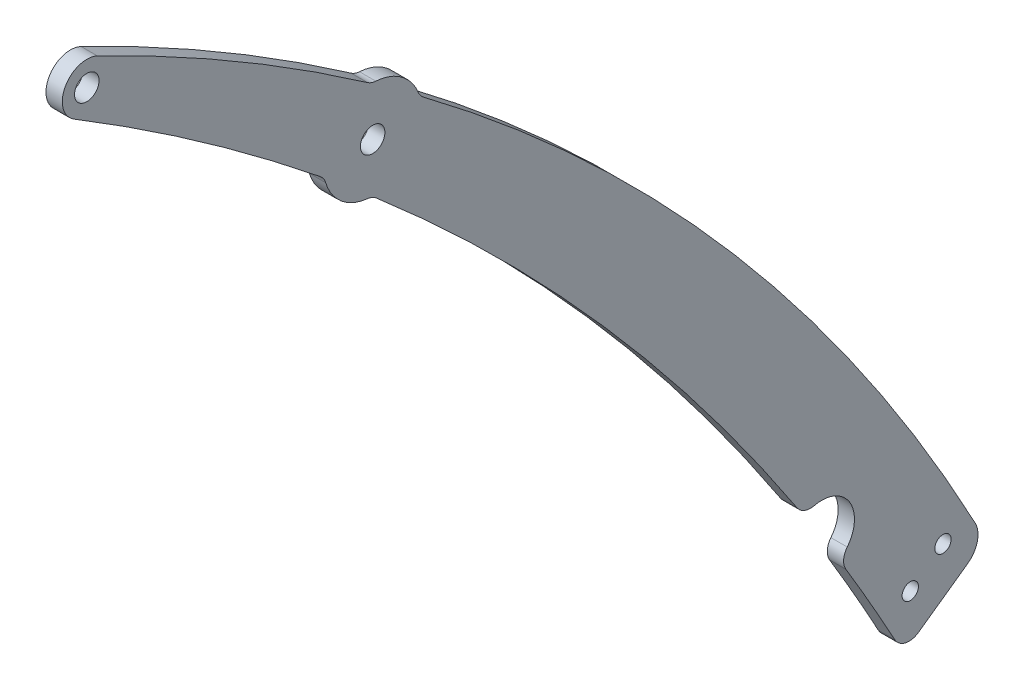
ISO-10303-21;
HEADER;
FILE_DESCRIPTION(('STEP AP214'),'2;1');
FILE_NAME('part.step','',(''),(''),'','','');
FILE_SCHEMA(('AUTOMOTIVE_DESIGN { 1 0 10303 214 1 1 1 1 }'));
ENDSEC;
DATA;
#1=APPLICATION_CONTEXT('core data for automotive mechanical design processes');
#2=APPLICATION_PROTOCOL_DEFINITION('international standard','automotive_design',2000,#1);
#3=PRODUCT_CONTEXT('',#1,'mechanical');
#4=PRODUCT('Part','Part','',(#3));
#5=PRODUCT_RELATED_PRODUCT_CATEGORY('part','',(#4));
#6=PRODUCT_DEFINITION_FORMATION('','',#4);
#7=PRODUCT_DEFINITION_CONTEXT('part definition',#1,'design');
#8=PRODUCT_DEFINITION('design','',#6,#7);
#9=PRODUCT_DEFINITION_SHAPE('','',#8);
#10=(LENGTH_UNIT() NAMED_UNIT(*) SI_UNIT(.MILLI.,.METRE.));
#11=(NAMED_UNIT(*) PLANE_ANGLE_UNIT() SI_UNIT($,.RADIAN.));
#12=(NAMED_UNIT(*) SI_UNIT($,.STERADIAN.) SOLID_ANGLE_UNIT());
#13=UNCERTAINTY_MEASURE_WITH_UNIT(LENGTH_MEASURE(1.E-05),#10,'distance_accuracy_value','');
#14=(GEOMETRIC_REPRESENTATION_CONTEXT(3) GLOBAL_UNCERTAINTY_ASSIGNED_CONTEXT((#13)) GLOBAL_UNIT_ASSIGNED_CONTEXT((#10,
#11,#12)) REPRESENTATION_CONTEXT('',''));
#15=CARTESIAN_POINT('',(0.,0.,0.));
#16=DIRECTION('',(0.,0.,1.));
#17=DIRECTION('',(1.,0.,0.));
#18=AXIS2_PLACEMENT_3D('',#15,#16,#17);
#19=CARTESIAN_POINT('',(2.,-213.437913955734,103.020662423733));
#20=DIRECTION('',(-1.,0.,0.));
#21=DIRECTION('',(0.,0.,1.));
#22=AXIS2_PLACEMENT_3D('',#19,#20,#21);
#23=PLANE('',#22);
#24=CARTESIAN_POINT('',(2.,-213.437913955734,103.020662423733));
#25=DIRECTION('',(1.,0.,0.));
#26=DIRECTION('',(0.,0.,1.));
#27=AXIS2_PLACEMENT_3D('',#24,#25,#26);
#28=CIRCLE('',#27,240.);
#29=CARTESIAN_POINT('',(2.,-16.6566564036032,-34.3734301574331));
#30=VERTEX_POINT('',#29);
#31=CARTESIAN_POINT('',(2.,2.70174574627511,-1.30405901802194));
#32=VERTEX_POINT('',#31);
#33=EDGE_CURVE('E235',#30,#32,#28,.T.);
#34=ORIENTED_EDGE('',*,*,#33,.T.);
#35=CARTESIAN_POINT('',(2.,0.,0.));
#36=DIRECTION('',(1.,0.,0.));
#37=DIRECTION('',(0.,0.,-1.));
#38=AXIS2_PLACEMENT_3D('',#35,#36,#37);
#39=CIRCLE('',#38,3.);
#40=CARTESIAN_POINT('',(2.,-2.56328330971649,1.55871058061747));
#41=VERTEX_POINT('',#40);
#42=EDGE_CURVE('E131',#32,#41,#39,.T.);
#43=ORIENTED_EDGE('',*,*,#42,.T.);
#44=CARTESIAN_POINT('',(2.,-241.803058883256,147.038364771581));
#45=DIRECTION('',(-1.,0.,0.));
#46=DIRECTION('',(0.,0.,1.));
#47=AXIS2_PLACEMENT_3D('',#44,#45,#46);
#48=CIRCLE('',#47,280.);
#49=CARTESIAN_POINT('',(2.,-23.7320194927492,-28.5891438343998));
#50=VERTEX_POINT('',#49);
#51=EDGE_CURVE('E279',#41,#50,#48,.T.);
#52=ORIENTED_EDGE('',*,*,#51,.T.);
#53=CARTESIAN_POINT('',(2.,-25.2896697741099,-27.3346616300714));
#54=DIRECTION('',(-1.,0.,0.));
#55=DIRECTION('',(0.,0.,-1.));
#56=AXIS2_PLACEMENT_3D('',#53,#54,#55);
#57=CIRCLE('',#56,2.);
#58=CARTESIAN_POINT('',(2.,-24.7172523305823,-29.2509962225539));
#59=VERTEX_POINT('',#58);
#60=EDGE_CURVE('E300',#50,#59,#57,.T.);
#61=ORIENTED_EDGE('',*,*,#60,.T.);
#62=CARTESIAN_POINT('',(2.,-23.,-35.));
#63=DIRECTION('',(1.,0.,0.));
#64=DIRECTION('',(0.,0.,-1.));
#65=AXIS2_PLACEMENT_3D('',#62,#63,#64);
#66=CIRCLE('',#65,5.9999999999983);
#67=CARTESIAN_POINT('',(2.,-28.9654663374401,-34.3571848035024));
#68=VERTEX_POINT('',#67);
#69=EDGE_CURVE('E294',#59,#68,#66,.T.);
#70=ORIENTED_EDGE('',*,*,#69,.T.);
#71=CARTESIAN_POINT('',(2.,-30.9539551165874,-34.1429130713365));
#72=DIRECTION('',(-1.,0.,0.));
#73=DIRECTION('',(0.,0.,1.));
#74=AXIS2_PLACEMENT_3D('',#71,#72,#73);
#75=CIRCLE('',#74,2.);
#76=CARTESIAN_POINT('',(2.,-29.4370550894891,-35.4463755018611));
#77=VERTEX_POINT('',#76);
#78=EDGE_CURVE('E296',#68,#77,#75,.T.);
#79=ORIENTED_EDGE('',*,*,#78,.T.);
#80=CARTESIAN_POINT('',(2.,-241.803058883256,147.038364771581));
#81=DIRECTION('',(-1.,0.,0.));
#82=DIRECTION('',(0.,0.,1.));
#83=AXIS2_PLACEMENT_3D('',#80,#81,#82);
#84=CIRCLE('',#83,280.);
#85=CARTESIAN_POINT('',(2.,-88.0219773701525,-86.951761021496));
#86=VERTEX_POINT('',#85);
#87=EDGE_CURVE('E298',#77,#86,#84,.T.);
#88=ORIENTED_EDGE('',*,*,#87,.T.);
#89=CARTESIAN_POINT('',(2.,-86.9235410736303,-88.6231190628751));
#90=DIRECTION('',(1.,0.,0.));
#91=DIRECTION('',(0.,0.,1.));
#92=AXIS2_PLACEMENT_3D('',#89,#90,#91);
#93=CIRCLE('',#92,1.99999999999999);
#94=CARTESIAN_POINT('',(2.,-88.8701677537271,-89.0820793752501));
#95=VERTEX_POINT('',#94);
#96=EDGE_CURVE('E303',#86,#95,#93,.T.);
#97=ORIENTED_EDGE('',*,*,#96,.T.);
#98=CARTESIAN_POINT('',(2.,-92.7634211139207,-90.));
#99=DIRECTION('',(-1.,0.,0.));
#100=DIRECTION('',(0.,0.,1.));
#101=AXIS2_PLACEMENT_3D('',#98,#99,#100);
#102=CIRCLE('',#101,4.);
#103=CARTESIAN_POINT('',(2.,-95.2778043559762,-93.1109286253578));
#104=VERTEX_POINT('',#103);
#105=EDGE_CURVE('E307',#95,#104,#102,.T.);
#106=ORIENTED_EDGE('',*,*,#105,.T.);
#107=CARTESIAN_POINT('',(2.,-96.5349959770039,-94.6663929380367));
#108=DIRECTION('',(1.,0.,0.));
#109=DIRECTION('',(0.,0.,-1.));
#110=AXIS2_PLACEMENT_3D('',#107,#108,#109);
#111=CIRCLE('',#110,2.);
#112=CARTESIAN_POINT('',(2.,-97.5652659266937,-92.9521747982521));
#113=VERTEX_POINT('',#112);
#114=EDGE_CURVE('E310',#104,#113,#111,.T.);
#115=ORIENTED_EDGE('',*,*,#114,.T.);
#116=CARTESIAN_POINT('',(2.,-241.803058883256,147.038364771581));
#117=DIRECTION('',(-1.,0.,0.));
#118=DIRECTION('',(0.,0.,1.));
#119=AXIS2_PLACEMENT_3D('',#116,#117,#118);
#120=CIRCLE('',#119,280.);
#121=CARTESIAN_POINT('',(2.,-108.012595355263,-98.9293401592991));
#122=VERTEX_POINT('',#121);
#123=EDGE_CURVE('E313',#113,#122,#120,.T.);
#124=ORIENTED_EDGE('',*,*,#123,.T.);
#125=CARTESIAN_POINT('',(2.,-107.056949187206,-100.686252337377));
#126=DIRECTION('',(1.,0.,0.));
#127=DIRECTION('',(0.,0.,-1.));
#128=AXIS2_PLACEMENT_3D('',#125,#126,#127);
#129=CIRCLE('',#128,2.00000000000002);
#130=CARTESIAN_POINT('',(2.,-108.686473231818,-101.845843380819));
#131=VERTEX_POINT('',#130);
#132=EDGE_CURVE('E311',#122,#131,#129,.T.);
#133=ORIENTED_EDGE('',*,*,#132,.T.);
#134=DIRECTION('',(0.,0.579795521721094,-0.814762022306001));
#135=VECTOR('',#134,1.);
#136=CARTESIAN_POINT('',(2.,-104.404074838417,-107.86371596626));
#137=LINE('',#136,#135);
#138=CARTESIAN_POINT('',(2.,-104.404074838417,-107.86371596626));
#139=VERTEX_POINT('',#138);
#140=EDGE_CURVE('E312',#131,#139,#137,.T.);
#141=ORIENTED_EDGE('',*,*,#140,.T.);
#142=CARTESIAN_POINT('',(2.,-101.959788771499,-106.124329401097));
#143=DIRECTION('',(1.,0.,0.));
#144=DIRECTION('',(0.,0.,1.));
#145=AXIS2_PLACEMENT_3D('',#142,#143,#144);
#146=CIRCLE('',#145,2.99999999999998);
#147=CARTESIAN_POINT('',(2.,-100.548673262838,-108.771734360905));
#148=VERTEX_POINT('',#147);
#149=EDGE_CURVE('E320',#139,#148,#146,.T.);
#150=ORIENTED_EDGE('',*,*,#149,.T.);
#151=CARTESIAN_POINT('',(2.,-213.437913955734,103.020662423733));
#152=DIRECTION('',(1.,0.,0.));
#153=DIRECTION('',(0.,0.,1.));
#154=AXIS2_PLACEMENT_3D('',#151,#152,#153);
#155=CIRCLE('',#154,240.);
#156=CARTESIAN_POINT('',(2.,-21.621117117661,-41.22328528563));
#157=VERTEX_POINT('',#156);
#158=EDGE_CURVE('E178',#148,#157,#155,.T.);
#159=ORIENTED_EDGE('',*,*,#158,.T.);
#160=CARTESIAN_POINT('',(2.,-20.022643810677,-42.425318183208));
#161=DIRECTION('',(-1.,0.,0.));
#162=DIRECTION('',(0.,0.,-1.));
#163=AXIS2_PLACEMENT_3D('',#160,#161,#162);
#164=CIRCLE('',#163,2.);
#165=CARTESIAN_POINT('',(2.,-20.7669828580078,-40.5689886374058));
#166=VERTEX_POINT('',#165);
#167=EDGE_CURVE('E173',#157,#166,#164,.T.);
#168=ORIENTED_EDGE('',*,*,#167,.T.);
#169=CARTESIAN_POINT('',(2.,-23.,-35.));
#170=DIRECTION('',(1.,0.,0.));
#171=DIRECTION('',(0.,0.,-1.));
#172=AXIS2_PLACEMENT_3D('',#169,#170,#171);
#173=CIRCLE('',#172,5.99999999999925);
#174=CARTESIAN_POINT('',(2.,-17.0126094430022,-35.3887856967071));
#175=VERTEX_POINT('',#174);
#176=EDGE_CURVE('E180',#166,#175,#173,.T.);
#177=ORIENTED_EDGE('',*,*,#176,.T.);
#178=CARTESIAN_POINT('',(2.,-15.0168125906688,-35.5183809289428));
#179=DIRECTION('',(-1.,0.,0.));
#180=DIRECTION('',(0.,0.,-1.));
#181=AXIS2_PLACEMENT_3D('',#178,#179,#180);
#182=CIRCLE('',#181,2.);
#183=EDGE_CURVE('E59',#175,#30,#182,.T.);
#184=ORIENTED_EDGE('',*,*,#183,.T.);
#185=EDGE_LOOP('',(#34,#43,#52,#61,#70,#79,#88,#97,#106,#115,#124,#133,#141,#150,#159,#168,#177,#184));
#186=FACE_BOUND('',#185,.T.);
#187=CARTESIAN_POINT('',(2.,-100.814691776972,-104.832728480012));
#188=DIRECTION('',(1.,0.,0.));
#189=DIRECTION('',(0.,0.,-1.));
#190=AXIS2_PLACEMENT_3D('',#187,#188,#189);
#191=CIRCLE('',#190,0.999999999999998);
#192=CARTESIAN_POINT('',(2.,-100.814691776972,-105.832728480012));
#193=VERTEX_POINT('',#192);
#194=EDGE_CURVE('E205',#193,#193,#191,.T.);
#195=ORIENTED_EDGE('',*,*,#194,.F.);
#196=EDGE_LOOP('',(#195));
#197=FACE_BOUND('',#196,.T.);
#198=CARTESIAN_POINT('',(2.,-103.814691776972,-100.832728480012));
#199=DIRECTION('',(1.,0.,0.));
#200=DIRECTION('',(0.,0.,-1.));
#201=AXIS2_PLACEMENT_3D('',#198,#199,#200);
#202=CIRCLE('',#201,0.999999999999998);
#203=CARTESIAN_POINT('',(2.,-103.814691776972,-101.832728480012));
#204=VERTEX_POINT('',#203);
#205=EDGE_CURVE('E381',#204,#204,#202,.T.);
#206=ORIENTED_EDGE('',*,*,#205,.F.);
#207=EDGE_LOOP('',(#206));
#208=FACE_BOUND('',#207,.T.);
#209=CARTESIAN_POINT('',(2.,-23.,-35.));
#210=DIRECTION('',(1.,0.,0.));
#211=DIRECTION('',(0.,0.,-1.));
#212=AXIS2_PLACEMENT_3D('',#209,#210,#211);
#213=CIRCLE('',#212,1.5);
#214=CARTESIAN_POINT('',(2.,-23.,-36.5));
#215=VERTEX_POINT('',#214);
#216=EDGE_CURVE('E374',#215,#215,#213,.T.);
#217=ORIENTED_EDGE('',*,*,#216,.F.);
#218=EDGE_LOOP('',(#217));
#219=FACE_BOUND('',#218,.T.);
#220=CARTESIAN_POINT('',(2.,0.,0.));
#221=DIRECTION('',(1.,0.,0.));
#222=DIRECTION('',(0.,0.,-1.));
#223=AXIS2_PLACEMENT_3D('',#220,#221,#222);
#224=CIRCLE('',#223,1.5);
#225=CARTESIAN_POINT('',(2.,0.,-1.5));
#226=VERTEX_POINT('',#225);
#227=EDGE_CURVE('E368',#226,#226,#224,.T.);
#228=ORIENTED_EDGE('',*,*,#227,.F.);
#229=EDGE_LOOP('',(#228));
#230=FACE_BOUND('',#229,.T.);
#231=ADVANCED_FACE('F41',(#186,#197,#208,#219,#230),#23,.F.);
#232=CARTESIAN_POINT('',(0.,-213.437913955734,103.020662423733));
#233=DIRECTION('',(-1.,0.,0.));
#234=DIRECTION('',(0.,0.,1.));
#235=AXIS2_PLACEMENT_3D('',#232,#233,#234);
#236=PLANE('',#235);
#237=CARTESIAN_POINT('',(0.,-23.,-35.));
#238=DIRECTION('',(1.,0.,0.));
#239=DIRECTION('',(0.,0.,-1.));
#240=AXIS2_PLACEMENT_3D('',#237,#238,#239);
#241=CIRCLE('',#240,1.5);
#242=CARTESIAN_POINT('',(0.,-23.,-36.5));
#243=VERTEX_POINT('',#242);
#244=EDGE_CURVE('E375',#243,#243,#241,.T.);
#245=ORIENTED_EDGE('',*,*,#244,.T.);
#246=EDGE_LOOP('',(#245));
#247=FACE_BOUND('',#246,.T.);
#248=CARTESIAN_POINT('',(0.,-100.814691776972,-104.832728480012));
#249=DIRECTION('',(1.,0.,0.));
#250=DIRECTION('',(0.,0.,-1.));
#251=AXIS2_PLACEMENT_3D('',#248,#249,#250);
#252=CIRCLE('',#251,0.999999999999998);
#253=CARTESIAN_POINT('',(0.,-100.814691776972,-105.832728480012));
#254=VERTEX_POINT('',#253);
#255=EDGE_CURVE('E383',#254,#254,#252,.T.);
#256=ORIENTED_EDGE('',*,*,#255,.T.);
#257=EDGE_LOOP('',(#256));
#258=FACE_BOUND('',#257,.T.);
#259=CARTESIAN_POINT('',(0.,-213.437913955734,103.020662423733));
#260=DIRECTION('',(1.,0.,0.));
#261=DIRECTION('',(0.,0.,1.));
#262=AXIS2_PLACEMENT_3D('',#259,#260,#261);
#263=CIRCLE('',#262,240.);
#264=CARTESIAN_POINT('',(0.,-16.6566564036032,-34.3734301574331));
#265=VERTEX_POINT('',#264);
#266=CARTESIAN_POINT('',(0.,2.70174574627511,-1.30405901802194));
#267=VERTEX_POINT('',#266);
#268=EDGE_CURVE('E196',#265,#267,#263,.T.);
#269=ORIENTED_EDGE('',*,*,#268,.F.);
#270=CARTESIAN_POINT('',(0.,-15.0168125906688,-35.5183809289428));
#271=DIRECTION('',(-1.,0.,0.));
#272=DIRECTION('',(0.,0.,-1.));
#273=AXIS2_PLACEMENT_3D('',#270,#271,#272);
#274=CIRCLE('',#273,2.);
#275=CARTESIAN_POINT('',(0.,-17.0126094430022,-35.3887856967071));
#276=VERTEX_POINT('',#275);
#277=EDGE_CURVE('E125',#276,#265,#274,.T.);
#278=ORIENTED_EDGE('',*,*,#277,.F.);
#279=CARTESIAN_POINT('',(0.,-23.,-35.));
#280=DIRECTION('',(1.,0.,0.));
#281=DIRECTION('',(0.,0.,-1.));
#282=AXIS2_PLACEMENT_3D('',#279,#280,#281);
#283=CIRCLE('',#282,5.99999999999925);
#284=CARTESIAN_POINT('',(0.,-20.7669828580078,-40.5689886374058));
#285=VERTEX_POINT('',#284);
#286=EDGE_CURVE('E120',#285,#276,#283,.T.);
#287=ORIENTED_EDGE('',*,*,#286,.F.);
#288=CARTESIAN_POINT('',(0.,-20.022643810677,-42.425318183208));
#289=DIRECTION('',(-1.,0.,0.));
#290=DIRECTION('',(0.,0.,-1.));
#291=AXIS2_PLACEMENT_3D('',#288,#289,#290);
#292=CIRCLE('',#291,2.);
#293=CARTESIAN_POINT('',(0.,-21.621117117661,-41.22328528563));
#294=VERTEX_POINT('',#293);
#295=EDGE_CURVE('E187',#294,#285,#292,.T.);
#296=ORIENTED_EDGE('',*,*,#295,.F.);
#297=CARTESIAN_POINT('',(0.,-213.437913955734,103.020662423733));
#298=DIRECTION('',(1.,0.,0.));
#299=DIRECTION('',(0.,0.,1.));
#300=AXIS2_PLACEMENT_3D('',#297,#298,#299);
#301=CIRCLE('',#300,240.);
#302=CARTESIAN_POINT('',(0.,-100.548673262838,-108.771734360905));
#303=VERTEX_POINT('',#302);
#304=EDGE_CURVE('E227',#303,#294,#301,.T.);
#305=ORIENTED_EDGE('',*,*,#304,.F.);
#306=CARTESIAN_POINT('',(0.,-101.959788771499,-106.124329401097));
#307=DIRECTION('',(1.,0.,0.));
#308=DIRECTION('',(0.,0.,1.));
#309=AXIS2_PLACEMENT_3D('',#306,#307,#308);
#310=CIRCLE('',#309,2.99999999999998);
#311=CARTESIAN_POINT('',(0.,-104.404074838417,-107.86371596626));
#312=VERTEX_POINT('',#311);
#313=EDGE_CURVE('E226',#312,#303,#310,.T.);
#314=ORIENTED_EDGE('',*,*,#313,.F.);
#315=DIRECTION('',(0.,0.579795521721094,-0.814762022306001));
#316=VECTOR('',#315,1.);
#317=CARTESIAN_POINT('',(0.,-104.404074838417,-107.86371596626));
#318=LINE('',#317,#316);
#319=CARTESIAN_POINT('',(0.,-108.686473231818,-101.845843380819));
#320=VERTEX_POINT('',#319);
#321=EDGE_CURVE('E221',#320,#312,#318,.T.);
#322=ORIENTED_EDGE('',*,*,#321,.F.);
#323=CARTESIAN_POINT('',(0.,-107.056949187206,-100.686252337377));
#324=DIRECTION('',(1.,0.,0.));
#325=DIRECTION('',(0.,0.,-1.));
#326=AXIS2_PLACEMENT_3D('',#323,#324,#325);
#327=CIRCLE('',#326,2.00000000000002);
#328=CARTESIAN_POINT('',(0.,-108.012595355263,-98.9293401592991));
#329=VERTEX_POINT('',#328);
#330=EDGE_CURVE('E225',#329,#320,#327,.T.);
#331=ORIENTED_EDGE('',*,*,#330,.F.);
#332=CARTESIAN_POINT('',(0.,-241.803058883256,147.038364771581));
#333=DIRECTION('',(-1.,0.,0.));
#334=DIRECTION('',(0.,0.,1.));
#335=AXIS2_PLACEMENT_3D('',#332,#333,#334);
#336=CIRCLE('',#335,280.);
#337=CARTESIAN_POINT('',(0.,-97.5652659266937,-92.9521747982521));
#338=VERTEX_POINT('',#337);
#339=EDGE_CURVE('E219',#338,#329,#336,.T.);
#340=ORIENTED_EDGE('',*,*,#339,.F.);
#341=CARTESIAN_POINT('',(0.,-96.5349959770039,-94.6663929380367));
#342=DIRECTION('',(1.,0.,0.));
#343=DIRECTION('',(0.,0.,-1.));
#344=AXIS2_PLACEMENT_3D('',#341,#342,#343);
#345=CIRCLE('',#344,2.);
#346=CARTESIAN_POINT('',(0.,-95.2778043559762,-93.1109286253578));
#347=VERTEX_POINT('',#346);
#348=EDGE_CURVE('E217',#347,#338,#345,.T.);
#349=ORIENTED_EDGE('',*,*,#348,.F.);
#350=CARTESIAN_POINT('',(0.,-92.7634211139207,-90.));
#351=DIRECTION('',(-1.,0.,0.));
#352=DIRECTION('',(0.,0.,1.));
#353=AXIS2_PLACEMENT_3D('',#350,#351,#352);
#354=CIRCLE('',#353,4.);
#355=CARTESIAN_POINT('',(0.,-88.8701677537271,-89.0820793752501));
#356=VERTEX_POINT('',#355);
#357=EDGE_CURVE('E216',#356,#347,#354,.T.);
#358=ORIENTED_EDGE('',*,*,#357,.F.);
#359=CARTESIAN_POINT('',(0.,-86.9235410736303,-88.6231190628751));
#360=DIRECTION('',(1.,0.,0.));
#361=DIRECTION('',(0.,0.,1.));
#362=AXIS2_PLACEMENT_3D('',#359,#360,#361);
#363=CIRCLE('',#362,1.99999999999999);
#364=CARTESIAN_POINT('',(0.,-88.0219773701525,-86.951761021496));
#365=VERTEX_POINT('',#364);
#366=EDGE_CURVE('E212',#365,#356,#363,.T.);
#367=ORIENTED_EDGE('',*,*,#366,.F.);
#368=CARTESIAN_POINT('',(0.,-241.803058883256,147.038364771581));
#369=DIRECTION('',(-1.,0.,0.));
#370=DIRECTION('',(0.,0.,1.));
#371=AXIS2_PLACEMENT_3D('',#368,#369,#370);
#372=CIRCLE('',#371,280.);
#373=CARTESIAN_POINT('',(0.,-29.4370550894891,-35.4463755018611));
#374=VERTEX_POINT('',#373);
#375=EDGE_CURVE('E215',#374,#365,#372,.T.);
#376=ORIENTED_EDGE('',*,*,#375,.F.);
#377=CARTESIAN_POINT('',(0.,-30.9539551165874,-34.1429130713365));
#378=DIRECTION('',(-1.,0.,0.));
#379=DIRECTION('',(0.,0.,1.));
#380=AXIS2_PLACEMENT_3D('',#377,#378,#379);
#381=CIRCLE('',#380,2.);
#382=CARTESIAN_POINT('',(0.,-28.9654663374401,-34.3571848035024));
#383=VERTEX_POINT('',#382);
#384=EDGE_CURVE('E209',#383,#374,#381,.T.);
#385=ORIENTED_EDGE('',*,*,#384,.F.);
#386=CARTESIAN_POINT('',(0.,-23.,-35.));
#387=DIRECTION('',(1.,0.,0.));
#388=DIRECTION('',(0.,0.,-1.));
#389=AXIS2_PLACEMENT_3D('',#386,#387,#388);
#390=CIRCLE('',#389,5.9999999999983);
#391=CARTESIAN_POINT('',(0.,-24.7172523305823,-29.2509962225539));
#392=VERTEX_POINT('',#391);
#393=EDGE_CURVE('E208',#392,#383,#390,.T.);
#394=ORIENTED_EDGE('',*,*,#393,.F.);
#395=CARTESIAN_POINT('',(0.,-25.2896697741099,-27.3346616300714));
#396=DIRECTION('',(-1.,0.,0.));
#397=DIRECTION('',(0.,0.,-1.));
#398=AXIS2_PLACEMENT_3D('',#395,#396,#397);
#399=CIRCLE('',#398,2.);
#400=CARTESIAN_POINT('',(0.,-23.7320194927492,-28.5891438343998));
#401=VERTEX_POINT('',#400);
#402=EDGE_CURVE('E206',#401,#392,#399,.T.);
#403=ORIENTED_EDGE('',*,*,#402,.F.);
#404=CARTESIAN_POINT('',(0.,-241.803058883256,147.038364771581));
#405=DIRECTION('',(-1.,0.,0.));
#406=DIRECTION('',(0.,0.,1.));
#407=AXIS2_PLACEMENT_3D('',#404,#405,#406);
#408=CIRCLE('',#407,280.);
#409=CARTESIAN_POINT('',(0.,-2.56328330971649,1.55871058061747));
#410=VERTEX_POINT('',#409);
#411=EDGE_CURVE('E204',#410,#401,#408,.T.);
#412=ORIENTED_EDGE('',*,*,#411,.F.);
#413=CARTESIAN_POINT('',(0.,0.,0.));
#414=DIRECTION('',(1.,0.,0.));
#415=DIRECTION('',(0.,0.,-1.));
#416=AXIS2_PLACEMENT_3D('',#413,#414,#415);
#417=CIRCLE('',#416,3.);
#418=EDGE_CURVE('E203',#267,#410,#417,.T.);
#419=ORIENTED_EDGE('',*,*,#418,.F.);
#420=EDGE_LOOP('',(#269,#278,#287,#296,#305,#314,#322,#331,#340,#349,#358,#367,#376,#385,#394,
#403,#412,#419));
#421=FACE_BOUND('',#420,.T.);
#422=CARTESIAN_POINT('',(0.,-103.814691776972,-100.832728480012));
#423=DIRECTION('',(1.,0.,0.));
#424=DIRECTION('',(0.,0.,-1.));
#425=AXIS2_PLACEMENT_3D('',#422,#423,#424);
#426=CIRCLE('',#425,0.999999999999998);
#427=CARTESIAN_POINT('',(0.,-103.814691776972,-101.832728480012));
#428=VERTEX_POINT('',#427);
#429=EDGE_CURVE('E378',#428,#428,#426,.T.);
#430=ORIENTED_EDGE('',*,*,#429,.T.);
#431=EDGE_LOOP('',(#430));
#432=FACE_BOUND('',#431,.T.);
#433=CARTESIAN_POINT('',(0.,0.,0.));
#434=DIRECTION('',(1.,0.,0.));
#435=DIRECTION('',(0.,0.,-1.));
#436=AXIS2_PLACEMENT_3D('',#433,#434,#435);
#437=CIRCLE('',#436,1.5);
#438=CARTESIAN_POINT('',(0.,0.,-1.5));
#439=VERTEX_POINT('',#438);
#440=EDGE_CURVE('E369',#439,#439,#437,.T.);
#441=ORIENTED_EDGE('',*,*,#440,.T.);
#442=EDGE_LOOP('',(#441));
#443=FACE_BOUND('',#442,.T.);
#444=ADVANCED_FACE('F285',(#247,#258,#421,#432,#443),#236,.T.);
#445=CARTESIAN_POINT('',(2.,-213.437913955734,103.020662423733));
#446=DIRECTION('',(-1.,0.,0.));
#447=DIRECTION('',(0.,0.,1.));
#448=AXIS2_PLACEMENT_3D('',#445,#446,#447);
#449=CYLINDRICAL_SURFACE('',#448,240.);
#450=ORIENTED_EDGE('',*,*,#268,.T.);
#451=DIRECTION('',(-1.,0.,0.));
#452=VECTOR('',#451,1.);
#453=CARTESIAN_POINT('',(2.,2.70174574627511,-1.30405901802194));
#454=LINE('',#453,#452);
#455=EDGE_CURVE('E11',#32,#267,#454,.T.);
#456=ORIENTED_EDGE('',*,*,#455,.F.);
#457=ORIENTED_EDGE('',*,*,#33,.F.);
#458=DIRECTION('',(-1.,0.,0.));
#459=VECTOR('',#458,1.);
#460=CARTESIAN_POINT('',(2.,-16.6566564036032,-34.3734301574331));
#461=LINE('',#460,#459);
#462=EDGE_CURVE('E191',#30,#265,#461,.T.);
#463=ORIENTED_EDGE('',*,*,#462,.T.);
#464=EDGE_LOOP('',(#450,#456,#457,#463));
#465=FACE_BOUND('',#464,.T.);
#466=ADVANCED_FACE('F43',(#465),#449,.T.);
#467=CARTESIAN_POINT('',(2.,0.,0.));
#468=DIRECTION('',(-1.,0.,0.));
#469=DIRECTION('',(0.,0.,1.));
#470=AXIS2_PLACEMENT_3D('',#467,#468,#469);
#471=CYLINDRICAL_SURFACE('',#470,3.);
#472=ORIENTED_EDGE('',*,*,#418,.T.);
#473=DIRECTION('',(-1.,0.,0.));
#474=VECTOR('',#473,1.);
#475=CARTESIAN_POINT('',(2.,-2.56328330971649,1.55871058061747));
#476=LINE('',#475,#474);
#477=EDGE_CURVE('E49',#41,#410,#476,.T.);
#478=ORIENTED_EDGE('',*,*,#477,.F.);
#479=ORIENTED_EDGE('',*,*,#42,.F.);
#480=ORIENTED_EDGE('',*,*,#455,.T.);
#481=EDGE_LOOP('',(#472,#478,#479,#480));
#482=FACE_BOUND('',#481,.T.);
#483=ADVANCED_FACE('F559',(#482),#471,.T.);
#484=CARTESIAN_POINT('',(2.,-241.803058883256,147.038364771581));
#485=DIRECTION('',(-1.,0.,0.));
#486=DIRECTION('',(0.,0.,1.));
#487=AXIS2_PLACEMENT_3D('',#484,#485,#486);
#488=CYLINDRICAL_SURFACE('',#487,280.);
#489=ORIENTED_EDGE('',*,*,#411,.T.);
#490=DIRECTION('',(-1.,0.,0.));
#491=VECTOR('',#490,1.);
#492=CARTESIAN_POINT('',(2.,-23.7320194927492,-28.5891438343998));
#493=LINE('',#492,#491);
#494=EDGE_CURVE('E269',#50,#401,#493,.T.);
#495=ORIENTED_EDGE('',*,*,#494,.F.);
#496=ORIENTED_EDGE('',*,*,#51,.F.);
#497=ORIENTED_EDGE('',*,*,#477,.T.);
#498=EDGE_LOOP('',(#489,#495,#496,#497));
#499=FACE_BOUND('',#498,.T.);
#500=ADVANCED_FACE('F277',(#499),#488,.F.);
#501=CARTESIAN_POINT('',(2.,-25.2896697741099,-27.3346616300714));
#502=DIRECTION('',(-1.,0.,0.));
#503=DIRECTION('',(0.,0.,1.));
#504=AXIS2_PLACEMENT_3D('',#501,#502,#503);
#505=CYLINDRICAL_SURFACE('',#504,2.);
#506=ORIENTED_EDGE('',*,*,#402,.T.);
#507=DIRECTION('',(-1.,0.,0.));
#508=VECTOR('',#507,1.);
#509=CARTESIAN_POINT('',(2.,-24.7172523305823,-29.2509962225539));
#510=LINE('',#509,#508);
#511=EDGE_CURVE('E270',#59,#392,#510,.T.);
#512=ORIENTED_EDGE('',*,*,#511,.F.);
#513=ORIENTED_EDGE('',*,*,#60,.F.);
#514=ORIENTED_EDGE('',*,*,#494,.T.);
#515=EDGE_LOOP('',(#506,#512,#513,#514));
#516=FACE_BOUND('',#515,.T.);
#517=ADVANCED_FACE('F290',(#516),#505,.F.);
#518=CARTESIAN_POINT('',(2.,-23.,-35.));
#519=DIRECTION('',(-1.,0.,0.));
#520=DIRECTION('',(0.,0.,1.));
#521=AXIS2_PLACEMENT_3D('',#518,#519,#520);
#522=CYLINDRICAL_SURFACE('',#521,5.9999999999983);
#523=ORIENTED_EDGE('',*,*,#393,.T.);
#524=DIRECTION('',(-1.,0.,0.));
#525=VECTOR('',#524,1.);
#526=CARTESIAN_POINT('',(2.,-28.9654663374401,-34.3571848035024));
#527=LINE('',#526,#525);
#528=EDGE_CURVE('E262',#68,#383,#527,.T.);
#529=ORIENTED_EDGE('',*,*,#528,.F.);
#530=ORIENTED_EDGE('',*,*,#69,.F.);
#531=ORIENTED_EDGE('',*,*,#511,.T.);
#532=EDGE_LOOP('',(#523,#529,#530,#531));
#533=FACE_BOUND('',#532,.T.);
#534=ADVANCED_FACE('F295',(#533),#522,.T.);
#535=CARTESIAN_POINT('',(2.,-30.9539551165874,-34.1429130713365));
#536=DIRECTION('',(-1.,0.,0.));
#537=DIRECTION('',(0.,0.,1.));
#538=AXIS2_PLACEMENT_3D('',#535,#536,#537);
#539=CYLINDRICAL_SURFACE('',#538,2.);
#540=ORIENTED_EDGE('',*,*,#384,.T.);
#541=DIRECTION('',(-1.,0.,0.));
#542=VECTOR('',#541,1.);
#543=CARTESIAN_POINT('',(2.,-29.4370550894891,-35.4463755018611));
#544=LINE('',#543,#542);
#545=EDGE_CURVE('E261',#77,#374,#544,.T.);
#546=ORIENTED_EDGE('',*,*,#545,.F.);
#547=ORIENTED_EDGE('',*,*,#78,.F.);
#548=ORIENTED_EDGE('',*,*,#528,.T.);
#549=EDGE_LOOP('',(#540,#546,#547,#548));
#550=FACE_BOUND('',#549,.T.);
#551=ADVANCED_FACE('F523',(#550),#539,.F.);
#552=CARTESIAN_POINT('',(2.,-241.803058883256,147.038364771581));
#553=DIRECTION('',(-1.,0.,0.));
#554=DIRECTION('',(0.,0.,1.));
#555=AXIS2_PLACEMENT_3D('',#552,#553,#554);
#556=CYLINDRICAL_SURFACE('',#555,280.);
#557=ORIENTED_EDGE('',*,*,#375,.T.);
#558=DIRECTION('',(-1.,0.,0.));
#559=VECTOR('',#558,1.);
#560=CARTESIAN_POINT('',(2.,-88.0219773701525,-86.951761021496));
#561=LINE('',#560,#559);
#562=EDGE_CURVE('E256',#86,#365,#561,.T.);
#563=ORIENTED_EDGE('',*,*,#562,.F.);
#564=ORIENTED_EDGE('',*,*,#87,.F.);
#565=ORIENTED_EDGE('',*,*,#545,.T.);
#566=EDGE_LOOP('',(#557,#563,#564,#565));
#567=FACE_BOUND('',#566,.T.);
#568=ADVANCED_FACE('F513',(#567),#556,.F.);
#569=CARTESIAN_POINT('',(2.,-86.9235410736303,-88.6231190628751));
#570=DIRECTION('',(-1.,0.,0.));
#571=DIRECTION('',(0.,0.,1.));
#572=AXIS2_PLACEMENT_3D('',#569,#570,#571);
#573=CYLINDRICAL_SURFACE('',#572,1.99999999999999);
#574=ORIENTED_EDGE('',*,*,#366,.T.);
#575=DIRECTION('',(-1.,0.,0.));
#576=VECTOR('',#575,1.);
#577=CARTESIAN_POINT('',(2.,-88.8701677537271,-89.0820793752501));
#578=LINE('',#577,#576);
#579=EDGE_CURVE('E254',#95,#356,#578,.T.);
#580=ORIENTED_EDGE('',*,*,#579,.F.);
#581=ORIENTED_EDGE('',*,*,#96,.F.);
#582=ORIENTED_EDGE('',*,*,#562,.T.);
#583=EDGE_LOOP('',(#574,#580,#581,#582));
#584=FACE_BOUND('',#583,.T.);
#585=ADVANCED_FACE('F504',(#584),#573,.T.);
#586=CARTESIAN_POINT('',(2.,-92.7634211139207,-90.));
#587=DIRECTION('',(-1.,0.,0.));
#588=DIRECTION('',(0.,0.,1.));
#589=AXIS2_PLACEMENT_3D('',#586,#587,#588);
#590=CYLINDRICAL_SURFACE('',#589,4.);
#591=ORIENTED_EDGE('',*,*,#357,.T.);
#592=DIRECTION('',(-1.,0.,0.));
#593=VECTOR('',#592,1.);
#594=CARTESIAN_POINT('',(2.,-95.2778043559762,-93.1109286253578));
#595=LINE('',#594,#593);
#596=EDGE_CURVE('E252',#104,#347,#595,.T.);
#597=ORIENTED_EDGE('',*,*,#596,.F.);
#598=ORIENTED_EDGE('',*,*,#105,.F.);
#599=ORIENTED_EDGE('',*,*,#579,.T.);
#600=EDGE_LOOP('',(#591,#597,#598,#599));
#601=FACE_BOUND('',#600,.T.);
#602=ADVANCED_FACE('F494',(#601),#590,.F.);
#603=CARTESIAN_POINT('',(2.,-96.5349959770039,-94.6663929380367));
#604=DIRECTION('',(-1.,0.,0.));
#605=DIRECTION('',(0.,0.,1.));
#606=AXIS2_PLACEMENT_3D('',#603,#604,#605);
#607=CYLINDRICAL_SURFACE('',#606,2.);
#608=ORIENTED_EDGE('',*,*,#348,.T.);
#609=DIRECTION('',(-1.,0.,0.));
#610=VECTOR('',#609,1.);
#611=CARTESIAN_POINT('',(2.,-97.5652659266937,-92.9521747982521));
#612=LINE('',#611,#610);
#613=EDGE_CURVE('E246',#113,#338,#612,.T.);
#614=ORIENTED_EDGE('',*,*,#613,.F.);
#615=ORIENTED_EDGE('',*,*,#114,.F.);
#616=ORIENTED_EDGE('',*,*,#596,.T.);
#617=EDGE_LOOP('',(#608,#614,#615,#616));
#618=FACE_BOUND('',#617,.T.);
#619=ADVANCED_FACE('F484',(#618),#607,.T.);
#620=CARTESIAN_POINT('',(2.,-241.803058883256,147.038364771581));
#621=DIRECTION('',(-1.,0.,0.));
#622=DIRECTION('',(0.,0.,1.));
#623=AXIS2_PLACEMENT_3D('',#620,#621,#622);
#624=CYLINDRICAL_SURFACE('',#623,280.);
#625=ORIENTED_EDGE('',*,*,#339,.T.);
#626=DIRECTION('',(-1.,0.,0.));
#627=VECTOR('',#626,1.);
#628=CARTESIAN_POINT('',(2.,-108.012595355263,-98.9293401592991));
#629=LINE('',#628,#627);
#630=EDGE_CURVE('E247',#122,#329,#629,.T.);
#631=ORIENTED_EDGE('',*,*,#630,.F.);
#632=ORIENTED_EDGE('',*,*,#123,.F.);
#633=ORIENTED_EDGE('',*,*,#613,.T.);
#634=EDGE_LOOP('',(#625,#631,#632,#633));
#635=FACE_BOUND('',#634,.T.);
#636=ADVANCED_FACE('F474',(#635),#624,.F.);
#637=CARTESIAN_POINT('',(2.,-107.056949187206,-100.686252337377));
#638=DIRECTION('',(-1.,0.,0.));
#639=DIRECTION('',(0.,0.,1.));
#640=AXIS2_PLACEMENT_3D('',#637,#638,#639);
#641=CYLINDRICAL_SURFACE('',#640,2.00000000000002);
#642=ORIENTED_EDGE('',*,*,#330,.T.);
#643=DIRECTION('',(-1.,0.,0.));
#644=VECTOR('',#643,1.);
#645=CARTESIAN_POINT('',(2.,-108.686473231818,-101.845843380819));
#646=LINE('',#645,#644);
#647=EDGE_CURVE('E242',#131,#320,#646,.T.);
#648=ORIENTED_EDGE('',*,*,#647,.F.);
#649=ORIENTED_EDGE('',*,*,#132,.F.);
#650=ORIENTED_EDGE('',*,*,#630,.T.);
#651=EDGE_LOOP('',(#642,#648,#649,#650));
#652=FACE_BOUND('',#651,.T.);
#653=ADVANCED_FACE('F464',(#652),#641,.T.);
#654=CARTESIAN_POINT('',(2.,-104.404074838417,-107.86371596626));
#655=DIRECTION('',(0.,0.814762022306001,0.579795521721094));
#656=DIRECTION('',(0.,-0.579795521721094,0.814762022306001));
#657=AXIS2_PLACEMENT_3D('',#654,#655,#656);
#658=PLANE('',#657);
#659=ORIENTED_EDGE('',*,*,#321,.T.);
#660=DIRECTION('',(-1.,0.,0.));
#661=VECTOR('',#660,1.);
#662=CARTESIAN_POINT('',(2.,-104.404074838417,-107.86371596626));
#663=LINE('',#662,#661);
#664=EDGE_CURVE('E238',#139,#312,#663,.T.);
#665=ORIENTED_EDGE('',*,*,#664,.F.);
#666=ORIENTED_EDGE('',*,*,#140,.F.);
#667=ORIENTED_EDGE('',*,*,#647,.T.);
#668=EDGE_LOOP('',(#659,#665,#666,#667));
#669=FACE_BOUND('',#668,.T.);
#670=ADVANCED_FACE('F457',(#669),#658,.F.);
#671=CARTESIAN_POINT('',(2.,-101.959788771499,-106.124329401097));
#672=DIRECTION('',(-1.,0.,0.));
#673=DIRECTION('',(0.,0.,1.));
#674=AXIS2_PLACEMENT_3D('',#671,#672,#673);
#675=CYLINDRICAL_SURFACE('',#674,2.99999999999998);
#676=ORIENTED_EDGE('',*,*,#313,.T.);
#677=DIRECTION('',(-1.,0.,0.));
#678=VECTOR('',#677,1.);
#679=CARTESIAN_POINT('',(2.,-100.548673262838,-108.771734360905));
#680=LINE('',#679,#678);
#681=EDGE_CURVE('E240',#148,#303,#680,.T.);
#682=ORIENTED_EDGE('',*,*,#681,.F.);
#683=ORIENTED_EDGE('',*,*,#149,.F.);
#684=ORIENTED_EDGE('',*,*,#664,.T.);
#685=EDGE_LOOP('',(#676,#682,#683,#684));
#686=FACE_BOUND('',#685,.T.);
#687=ADVANCED_FACE('F323',(#686),#675,.T.);
#688=CARTESIAN_POINT('',(2.,-213.437913955734,103.020662423733));
#689=DIRECTION('',(-1.,0.,0.));
#690=DIRECTION('',(0.,0.,1.));
#691=AXIS2_PLACEMENT_3D('',#688,#689,#690);
#692=CYLINDRICAL_SURFACE('',#691,240.);
#693=ORIENTED_EDGE('',*,*,#304,.T.);
#694=DIRECTION('',(-1.,0.,0.));
#695=VECTOR('',#694,1.);
#696=CARTESIAN_POINT('',(2.,-21.621117117661,-41.22328528563));
#697=LINE('',#696,#695);
#698=EDGE_CURVE('E188',#157,#294,#697,.T.);
#699=ORIENTED_EDGE('',*,*,#698,.F.);
#700=ORIENTED_EDGE('',*,*,#158,.F.);
#701=ORIENTED_EDGE('',*,*,#681,.T.);
#702=EDGE_LOOP('',(#693,#699,#700,#701));
#703=FACE_BOUND('',#702,.T.);
#704=ADVANCED_FACE('F330',(#703),#692,.T.);
#705=CARTESIAN_POINT('',(2.,-20.022643810677,-42.425318183208));
#706=DIRECTION('',(-1.,0.,0.));
#707=DIRECTION('',(0.,0.,1.));
#708=AXIS2_PLACEMENT_3D('',#705,#706,#707);
#709=CYLINDRICAL_SURFACE('',#708,2.);
#710=ORIENTED_EDGE('',*,*,#295,.T.);
#711=DIRECTION('',(-1.,0.,0.));
#712=VECTOR('',#711,1.);
#713=CARTESIAN_POINT('',(2.,-20.7669828580078,-40.5689886374058));
#714=LINE('',#713,#712);
#715=EDGE_CURVE('E183',#166,#285,#714,.T.);
#716=ORIENTED_EDGE('',*,*,#715,.F.);
#717=ORIENTED_EDGE('',*,*,#167,.F.);
#718=ORIENTED_EDGE('',*,*,#698,.T.);
#719=EDGE_LOOP('',(#710,#716,#717,#718));
#720=FACE_BOUND('',#719,.T.);
#721=ADVANCED_FACE('F186',(#720),#709,.F.);
#722=CARTESIAN_POINT('',(2.,-23.,-35.));
#723=DIRECTION('',(-1.,0.,0.));
#724=DIRECTION('',(0.,0.,1.));
#725=AXIS2_PLACEMENT_3D('',#722,#723,#724);
#726=CYLINDRICAL_SURFACE('',#725,5.99999999999925);
#727=ORIENTED_EDGE('',*,*,#286,.T.);
#728=DIRECTION('',(-1.,0.,0.));
#729=VECTOR('',#728,1.);
#730=CARTESIAN_POINT('',(2.,-17.0126094430022,-35.3887856967071));
#731=LINE('',#730,#729);
#732=EDGE_CURVE('E189',#175,#276,#731,.T.);
#733=ORIENTED_EDGE('',*,*,#732,.F.);
#734=ORIENTED_EDGE('',*,*,#176,.F.);
#735=ORIENTED_EDGE('',*,*,#715,.T.);
#736=EDGE_LOOP('',(#727,#733,#734,#735));
#737=FACE_BOUND('',#736,.T.);
#738=ADVANCED_FACE('F194',(#737),#726,.T.);
#739=CARTESIAN_POINT('',(2.,-15.0168125906688,-35.5183809289428));
#740=DIRECTION('',(-1.,0.,0.));
#741=DIRECTION('',(0.,0.,1.));
#742=AXIS2_PLACEMENT_3D('',#739,#740,#741);
#743=CYLINDRICAL_SURFACE('',#742,2.);
#744=ORIENTED_EDGE('',*,*,#277,.T.);
#745=ORIENTED_EDGE('',*,*,#462,.F.);
#746=ORIENTED_EDGE('',*,*,#183,.F.);
#747=ORIENTED_EDGE('',*,*,#732,.T.);
#748=EDGE_LOOP('',(#744,#745,#746,#747));
#749=FACE_BOUND('',#748,.T.);
#750=ADVANCED_FACE('F332',(#749),#743,.F.);
#751=CARTESIAN_POINT('',(2.,-100.814691776972,-104.832728480012));
#752=DIRECTION('',(-1.,0.,0.));
#753=DIRECTION('',(0.,0.,1.));
#754=AXIS2_PLACEMENT_3D('',#751,#752,#753);
#755=CYLINDRICAL_SURFACE('',#754,0.999999999999998);
#756=ORIENTED_EDGE('',*,*,#194,.T.);
#757=EDGE_LOOP('',(#756));
#758=FACE_BOUND('',#757,.T.);
#759=ORIENTED_EDGE('',*,*,#255,.F.);
#760=EDGE_LOOP('',(#759));
#761=FACE_BOUND('',#760,.T.);
#762=ADVANCED_FACE('F334',(#758,#761),#755,.F.);
#763=CARTESIAN_POINT('',(2.,-103.814691776972,-100.832728480012));
#764=DIRECTION('',(-1.,0.,0.));
#765=DIRECTION('',(0.,0.,1.));
#766=AXIS2_PLACEMENT_3D('',#763,#764,#765);
#767=CYLINDRICAL_SURFACE('',#766,0.999999999999998);
#768=ORIENTED_EDGE('',*,*,#205,.T.);
#769=EDGE_LOOP('',(#768));
#770=FACE_BOUND('',#769,.T.);
#771=ORIENTED_EDGE('',*,*,#429,.F.);
#772=EDGE_LOOP('',(#771));
#773=FACE_BOUND('',#772,.T.);
#774=ADVANCED_FACE('F338',(#770,#773),#767,.F.);
#775=CARTESIAN_POINT('',(2.,-23.,-35.));
#776=DIRECTION('',(-1.,0.,0.));
#777=DIRECTION('',(0.,0.,1.));
#778=AXIS2_PLACEMENT_3D('',#775,#776,#777);
#779=CYLINDRICAL_SURFACE('',#778,1.5);
#780=ORIENTED_EDGE('',*,*,#216,.T.);
#781=EDGE_LOOP('',(#780));
#782=FACE_BOUND('',#781,.T.);
#783=ORIENTED_EDGE('',*,*,#244,.F.);
#784=EDGE_LOOP('',(#783));
#785=FACE_BOUND('',#784,.T.);
#786=ADVANCED_FACE('F352',(#782,#785),#779,.F.);
#787=CARTESIAN_POINT('',(2.,0.,0.));
#788=DIRECTION('',(-1.,0.,0.));
#789=DIRECTION('',(0.,0.,1.));
#790=AXIS2_PLACEMENT_3D('',#787,#788,#789);
#791=CYLINDRICAL_SURFACE('',#790,1.5);
#792=ORIENTED_EDGE('',*,*,#227,.T.);
#793=EDGE_LOOP('',(#792));
#794=FACE_BOUND('',#793,.T.);
#795=ORIENTED_EDGE('',*,*,#440,.F.);
#796=EDGE_LOOP('',(#795));
#797=FACE_BOUND('',#796,.T.);
#798=ADVANCED_FACE('F359',(#794,#797),#791,.F.);
#799=CLOSED_SHELL('',(#231,#444,#466,#483,#500,#517,#534,#551,#568,#585,#602,#619,#636,#653,
#670,#687,#704,#721,#738,#750,#762,#774,#786,#798));
#800=MANIFOLD_SOLID_BREP('B2',#799);
#801=ADVANCED_BREP_SHAPE_REPRESENTATION('',(#18,#800),#14);
#802=SHAPE_DEFINITION_REPRESENTATION(#9,#801);
ENDSEC;
END-ISO-10303-21;
